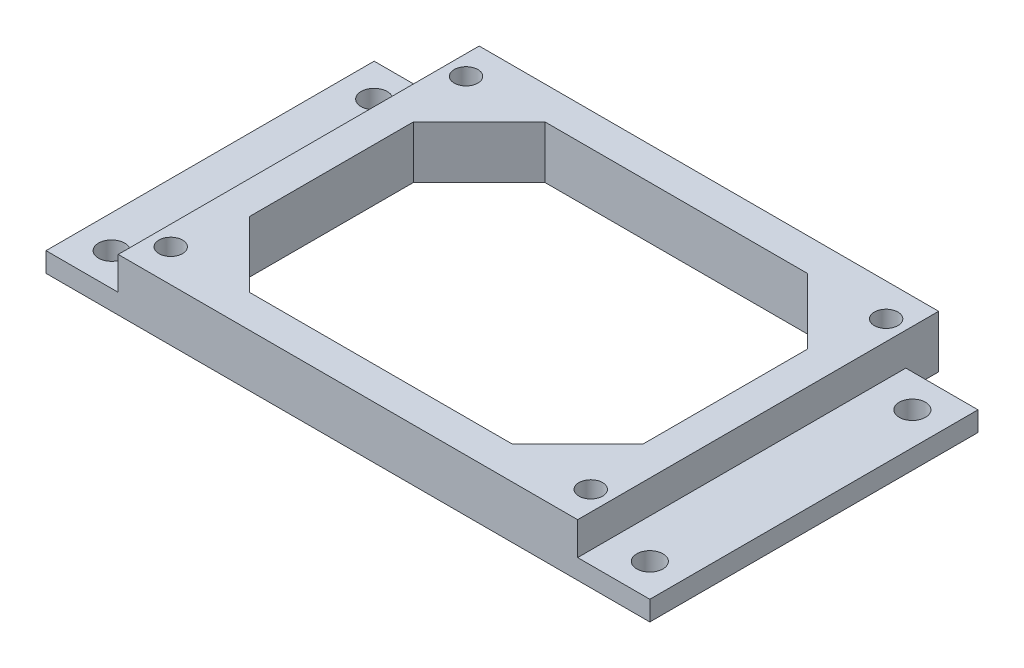
ISO-10303-21;
HEADER;
FILE_DESCRIPTION(('STEP AP214'),'2;1');
FILE_NAME('part.step','',(''),(''),'','','');
FILE_SCHEMA(('AUTOMOTIVE_DESIGN { 1 0 10303 214 1 1 1 1 }'));
ENDSEC;
DATA;
#1=APPLICATION_CONTEXT('core data for automotive mechanical design processes');
#2=APPLICATION_PROTOCOL_DEFINITION('international standard','automotive_design',2000,#1);
#3=PRODUCT_CONTEXT('',#1,'mechanical');
#4=PRODUCT('Part','Part','',(#3));
#5=PRODUCT_RELATED_PRODUCT_CATEGORY('part','',(#4));
#6=PRODUCT_DEFINITION_FORMATION('','',#4);
#7=PRODUCT_DEFINITION_CONTEXT('part definition',#1,'design');
#8=PRODUCT_DEFINITION('design','',#6,#7);
#9=PRODUCT_DEFINITION_SHAPE('','',#8);
#10=(LENGTH_UNIT() NAMED_UNIT(*) SI_UNIT(.MILLI.,.METRE.));
#11=(NAMED_UNIT(*) PLANE_ANGLE_UNIT() SI_UNIT($,.RADIAN.));
#12=(NAMED_UNIT(*) SI_UNIT($,.STERADIAN.) SOLID_ANGLE_UNIT());
#13=UNCERTAINTY_MEASURE_WITH_UNIT(LENGTH_MEASURE(1.E-05),#10,'distance_accuracy_value','');
#14=(GEOMETRIC_REPRESENTATION_CONTEXT(3) GLOBAL_UNCERTAINTY_ASSIGNED_CONTEXT((#13)) GLOBAL_UNIT_ASSIGNED_CONTEXT((#10,
#11,#12)) REPRESENTATION_CONTEXT('',''));
#15=CARTESIAN_POINT('',(0.,0.,0.));
#16=DIRECTION('',(0.,0.,1.));
#17=DIRECTION('',(1.,0.,0.));
#18=AXIS2_PLACEMENT_3D('',#15,#16,#17);
#19=CARTESIAN_POINT('',(-35.,5.,-25.));
#20=DIRECTION('',(0.,0.,1.));
#21=DIRECTION('',(1.,0.,0.));
#22=AXIS2_PLACEMENT_3D('',#19,#20,#21);
#23=PLANE('',#22);
#24=DIRECTION('',(0.,-1.,0.));
#25=VECTOR('',#24,1.);
#26=CARTESIAN_POINT('',(35.,5.,-25.));
#27=LINE('',#26,#25);
#28=CARTESIAN_POINT('',(35.,0.,-25.));
#29=VERTEX_POINT('',#28);
#30=CARTESIAN_POINT('',(35.,-3.,-25.));
#31=VERTEX_POINT('',#30);
#32=EDGE_CURVE('E11',#29,#31,#27,.T.);
#33=ORIENTED_EDGE('',*,*,#32,.F.);
#34=DIRECTION('',(1.,0.,0.));
#35=VECTOR('',#34,1.);
#36=CARTESIAN_POINT('',(-46.,0.,-25.));
#37=LINE('',#36,#35);
#38=CARTESIAN_POINT('',(46.,0.,-25.));
#39=VERTEX_POINT('',#38);
#40=EDGE_CURVE('E312',#29,#39,#37,.T.);
#41=ORIENTED_EDGE('',*,*,#40,.T.);
#42=DIRECTION('',(0.,1.,0.));
#43=VECTOR('',#42,1.);
#44=CARTESIAN_POINT('',(46.,-3.,-25.));
#45=LINE('',#44,#43);
#46=CARTESIAN_POINT('',(46.,-3.,-25.));
#47=VERTEX_POINT('',#46);
#48=EDGE_CURVE('E303',#47,#39,#45,.T.);
#49=ORIENTED_EDGE('',*,*,#48,.F.);
#50=DIRECTION('',(1.,0.,0.));
#51=VECTOR('',#50,1.);
#52=CARTESIAN_POINT('',(-46.,-3.,-25.));
#53=LINE('',#52,#51);
#54=EDGE_CURVE('E299',#31,#47,#53,.T.);
#55=ORIENTED_EDGE('',*,*,#54,.F.);
#56=EDGE_LOOP('',(#33,#41,#49,#55));
#57=FACE_BOUND('',#56,.T.);
#58=ADVANCED_FACE('F41',(#57),#23,.F.);
#59=DIRECTION('',(0.,1.,0.));
#60=VECTOR('',#59,1.);
#61=CARTESIAN_POINT('',(-35.,5.,-25.));
#62=LINE('',#61,#60);
#63=CARTESIAN_POINT('',(-35.,-3.,-25.));
#64=VERTEX_POINT('',#63);
#65=CARTESIAN_POINT('',(-35.,0.,-25.));
#66=VERTEX_POINT('',#65);
#67=EDGE_CURVE('E254',#64,#66,#62,.T.);
#68=ORIENTED_EDGE('',*,*,#67,.F.);
#69=CARTESIAN_POINT('',(-46.,-3.,-25.));
#70=VERTEX_POINT('',#69);
#71=EDGE_CURVE('E300',#70,#64,#53,.T.);
#72=ORIENTED_EDGE('',*,*,#71,.F.);
#73=DIRECTION('',(0.,1.,0.));
#74=VECTOR('',#73,1.);
#75=CARTESIAN_POINT('',(-46.,-3.,-25.));
#76=LINE('',#75,#74);
#77=CARTESIAN_POINT('',(-46.,0.,-25.));
#78=VERTEX_POINT('',#77);
#79=EDGE_CURVE('E317',#70,#78,#76,.T.);
#80=ORIENTED_EDGE('',*,*,#79,.T.);
#81=EDGE_CURVE('E295',#78,#66,#37,.T.);
#82=ORIENTED_EDGE('',*,*,#81,.T.);
#83=EDGE_LOOP('',(#68,#72,#80,#82));
#84=FACE_BOUND('',#83,.T.);
#85=ADVANCED_FACE('F369',(#84),#23,.F.);
#86=CARTESIAN_POINT('',(35.,5.,25.));
#87=DIRECTION('',(-1.,0.,0.));
#88=DIRECTION('',(0.,0.,1.));
#89=AXIS2_PLACEMENT_3D('',#86,#87,#88);
#90=PLANE('',#89);
#91=DIRECTION('',(0.,0.,-1.));
#92=VECTOR('',#91,1.);
#93=CARTESIAN_POINT('',(35.,0.,25.));
#94=LINE('',#93,#92);
#95=CARTESIAN_POINT('',(35.,0.,25.));
#96=VERTEX_POINT('',#95);
#97=EDGE_CURVE('E326',#96,#29,#94,.T.);
#98=ORIENTED_EDGE('',*,*,#97,.T.);
#99=ORIENTED_EDGE('',*,*,#32,.T.);
#100=DIRECTION('',(0.,0.,1.));
#101=VECTOR('',#100,1.);
#102=CARTESIAN_POINT('',(35.,-3.,-30.));
#103=LINE('',#102,#101);
#104=CARTESIAN_POINT('',(35.,-3.,-30.));
#105=VERTEX_POINT('',#104);
#106=EDGE_CURVE('E265',#105,#31,#103,.T.);
#107=ORIENTED_EDGE('',*,*,#106,.F.);
#108=DIRECTION('',(0.,-1.,0.));
#109=VECTOR('',#108,1.);
#110=CARTESIAN_POINT('',(35.,5.,-30.));
#111=LINE('',#110,#109);
#112=CARTESIAN_POINT('',(35.,5.,-30.));
#113=VERTEX_POINT('',#112);
#114=EDGE_CURVE('E250',#113,#105,#111,.T.);
#115=ORIENTED_EDGE('',*,*,#114,.F.);
#116=DIRECTION('',(0.,0.,-1.));
#117=VECTOR('',#116,1.);
#118=CARTESIAN_POINT('',(35.,5.,25.));
#119=LINE('',#118,#117);
#120=CARTESIAN_POINT('',(35.,5.,25.));
#121=VERTEX_POINT('',#120);
#122=EDGE_CURVE('E327',#121,#113,#119,.T.);
#123=ORIENTED_EDGE('',*,*,#122,.F.);
#124=DIRECTION('',(0.,-1.,0.));
#125=VECTOR('',#124,1.);
#126=CARTESIAN_POINT('',(35.,5.,25.));
#127=LINE('',#126,#125);
#128=EDGE_CURVE('E334',#121,#96,#127,.T.);
#129=ORIENTED_EDGE('',*,*,#128,.T.);
#130=EDGE_LOOP('',(#98,#99,#107,#115,#123,#129));
#131=FACE_BOUND('',#130,.T.);
#132=ADVANCED_FACE('F43',(#131),#90,.F.);
#133=CARTESIAN_POINT('',(-35.,5.,25.));
#134=DIRECTION('',(1.,0.,0.));
#135=DIRECTION('',(0.,0.,-1.));
#136=AXIS2_PLACEMENT_3D('',#133,#134,#135);
#137=PLANE('',#136);
#138=DIRECTION('',(0.,0.,1.));
#139=VECTOR('',#138,1.);
#140=CARTESIAN_POINT('',(-35.,0.,25.));
#141=LINE('',#140,#139);
#142=CARTESIAN_POINT('',(-35.,0.,25.));
#143=VERTEX_POINT('',#142);
#144=EDGE_CURVE('E330',#66,#143,#141,.T.);
#145=ORIENTED_EDGE('',*,*,#144,.T.);
#146=DIRECTION('',(0.,-1.,0.));
#147=VECTOR('',#146,1.);
#148=CARTESIAN_POINT('',(-35.,5.,25.));
#149=LINE('',#148,#147);
#150=CARTESIAN_POINT('',(-35.,5.,25.));
#151=VERTEX_POINT('',#150);
#152=EDGE_CURVE('E50',#151,#143,#149,.T.);
#153=ORIENTED_EDGE('',*,*,#152,.F.);
#154=DIRECTION('',(0.,0.,1.));
#155=VECTOR('',#154,1.);
#156=CARTESIAN_POINT('',(-35.,5.,25.));
#157=LINE('',#156,#155);
#158=CARTESIAN_POINT('',(-35.,5.,-30.));
#159=VERTEX_POINT('',#158);
#160=EDGE_CURVE('E329',#159,#151,#157,.T.);
#161=ORIENTED_EDGE('',*,*,#160,.F.);
#162=DIRECTION('',(0.,1.,0.));
#163=VECTOR('',#162,1.);
#164=CARTESIAN_POINT('',(-35.,5.,-30.));
#165=LINE('',#164,#163);
#166=CARTESIAN_POINT('',(-35.,-3.,-30.));
#167=VERTEX_POINT('',#166);
#168=EDGE_CURVE('E256',#167,#159,#165,.T.);
#169=ORIENTED_EDGE('',*,*,#168,.F.);
#170=DIRECTION('',(0.,0.,1.));
#171=VECTOR('',#170,1.);
#172=CARTESIAN_POINT('',(-35.,-3.,-30.));
#173=LINE('',#172,#171);
#174=EDGE_CURVE('E261',#167,#64,#173,.T.);
#175=ORIENTED_EDGE('',*,*,#174,.T.);
#176=ORIENTED_EDGE('',*,*,#67,.T.);
#177=EDGE_LOOP('',(#145,#153,#161,#169,#175,#176));
#178=FACE_BOUND('',#177,.T.);
#179=ADVANCED_FACE('F376',(#178),#137,.F.);
#180=CARTESIAN_POINT('',(-35.,5.,25.));
#181=DIRECTION('',(0.,0.,-1.));
#182=DIRECTION('',(-1.,0.,0.));
#183=AXIS2_PLACEMENT_3D('',#180,#181,#182);
#184=PLANE('',#183);
#185=ORIENTED_EDGE('',*,*,#152,.T.);
#186=DIRECTION('',(-1.,0.,0.));
#187=VECTOR('',#186,1.);
#188=CARTESIAN_POINT('',(-46.,0.,25.));
#189=LINE('',#188,#187);
#190=CARTESIAN_POINT('',(-46.,0.,25.));
#191=VERTEX_POINT('',#190);
#192=EDGE_CURVE('E306',#143,#191,#189,.T.);
#193=ORIENTED_EDGE('',*,*,#192,.T.);
#194=DIRECTION('',(0.,1.,0.));
#195=VECTOR('',#194,1.);
#196=CARTESIAN_POINT('',(-46.,-3.,25.));
#197=LINE('',#196,#195);
#198=CARTESIAN_POINT('',(-46.,-3.,25.));
#199=VERTEX_POINT('',#198);
#200=EDGE_CURVE('E320',#199,#191,#197,.T.);
#201=ORIENTED_EDGE('',*,*,#200,.F.);
#202=DIRECTION('',(-1.,0.,0.));
#203=VECTOR('',#202,1.);
#204=CARTESIAN_POINT('',(-46.,-3.,25.));
#205=LINE('',#204,#203);
#206=CARTESIAN_POINT('',(46.,-3.,25.));
#207=VERTEX_POINT('',#206);
#208=EDGE_CURVE('E294',#207,#199,#205,.T.);
#209=ORIENTED_EDGE('',*,*,#208,.F.);
#210=DIRECTION('',(0.,1.,0.));
#211=VECTOR('',#210,1.);
#212=CARTESIAN_POINT('',(46.,-3.,25.));
#213=LINE('',#212,#211);
#214=CARTESIAN_POINT('',(46.,0.,25.));
#215=VERTEX_POINT('',#214);
#216=EDGE_CURVE('E323',#207,#215,#213,.T.);
#217=ORIENTED_EDGE('',*,*,#216,.T.);
#218=EDGE_CURVE('E307',#215,#96,#189,.T.);
#219=ORIENTED_EDGE('',*,*,#218,.T.);
#220=ORIENTED_EDGE('',*,*,#128,.F.);
#221=DIRECTION('',(1.,0.,0.));
#222=VECTOR('',#221,1.);
#223=CARTESIAN_POINT('',(-35.,5.,25.));
#224=LINE('',#223,#222);
#225=EDGE_CURVE('E332',#151,#121,#224,.T.);
#226=ORIENTED_EDGE('',*,*,#225,.F.);
#227=EDGE_LOOP('',(#185,#193,#201,#209,#217,#219,#220,#226));
#228=FACE_BOUND('',#227,.T.);
#229=ADVANCED_FACE('F379',(#228),#184,.F.);
#230=CARTESIAN_POINT('',(0.,5.,0.));
#231=DIRECTION('',(0.,-1.,0.));
#232=DIRECTION('',(0.,0.,-1.));
#233=AXIS2_PLACEMENT_3D('',#230,#231,#232);
#234=PLANE('',#233);
#235=DIRECTION('',(-0.707106781186548,0.,-0.707106781186548));
#236=VECTOR('',#235,1.);
#237=CARTESIAN_POINT('',(30.,5.,-15.));
#238=LINE('',#237,#236);
#239=CARTESIAN_POINT('',(30.,5.,-15.));
#240=VERTEX_POINT('',#239);
#241=CARTESIAN_POINT('',(20.,5.,-25.));
#242=VERTEX_POINT('',#241);
#243=EDGE_CURVE('E206',#240,#242,#238,.T.);
#244=ORIENTED_EDGE('',*,*,#243,.F.);
#245=DIRECTION('',(0.,0.,-1.));
#246=VECTOR('',#245,1.);
#247=CARTESIAN_POINT('',(30.,5.,10.));
#248=LINE('',#247,#246);
#249=CARTESIAN_POINT('',(30.,5.,10.));
#250=VERTEX_POINT('',#249);
#251=EDGE_CURVE('E58',#250,#240,#248,.T.);
#252=ORIENTED_EDGE('',*,*,#251,.F.);
#253=DIRECTION('',(0.707106781186548,0.,-0.707106781186548));
#254=VECTOR('',#253,1.);
#255=CARTESIAN_POINT('',(20.,5.,20.));
#256=LINE('',#255,#254);
#257=CARTESIAN_POINT('',(20.,5.,20.));
#258=VERTEX_POINT('',#257);
#259=EDGE_CURVE('E186',#258,#250,#256,.T.);
#260=ORIENTED_EDGE('',*,*,#259,.F.);
#261=DIRECTION('',(1.,0.,0.));
#262=VECTOR('',#261,1.);
#263=CARTESIAN_POINT('',(-20.,5.,20.));
#264=LINE('',#263,#262);
#265=CARTESIAN_POINT('',(-20.,5.,20.));
#266=VERTEX_POINT('',#265);
#267=EDGE_CURVE('E189',#266,#258,#264,.T.);
#268=ORIENTED_EDGE('',*,*,#267,.F.);
#269=DIRECTION('',(0.707106781186547,0.,0.707106781186548));
#270=VECTOR('',#269,1.);
#271=CARTESIAN_POINT('',(-30.,5.,10.));
#272=LINE('',#271,#270);
#273=CARTESIAN_POINT('',(-30.,5.,10.));
#274=VERTEX_POINT('',#273);
#275=EDGE_CURVE('E217',#274,#266,#272,.T.);
#276=ORIENTED_EDGE('',*,*,#275,.F.);
#277=DIRECTION('',(0.,0.,1.));
#278=VECTOR('',#277,1.);
#279=CARTESIAN_POINT('',(-30.,5.,-15.));
#280=LINE('',#279,#278);
#281=CARTESIAN_POINT('',(-30.,5.,-15.));
#282=VERTEX_POINT('',#281);
#283=EDGE_CURVE('E214',#282,#274,#280,.T.);
#284=ORIENTED_EDGE('',*,*,#283,.F.);
#285=DIRECTION('',(-0.707106781186548,0.,0.707106781186547));
#286=VECTOR('',#285,1.);
#287=CARTESIAN_POINT('',(-20.,5.,-25.));
#288=LINE('',#287,#286);
#289=CARTESIAN_POINT('',(-20.,5.,-25.));
#290=VERTEX_POINT('',#289);
#291=EDGE_CURVE('E211',#290,#282,#288,.T.);
#292=ORIENTED_EDGE('',*,*,#291,.F.);
#293=DIRECTION('',(-1.,0.,0.));
#294=VECTOR('',#293,1.);
#295=CARTESIAN_POINT('',(20.,5.,-25.));
#296=LINE('',#295,#294);
#297=EDGE_CURVE('E208',#242,#290,#296,.T.);
#298=ORIENTED_EDGE('',*,*,#297,.F.);
#299=EDGE_LOOP('',(#244,#252,#260,#268,#276,#284,#292,#298));
#300=FACE_BOUND('',#299,.T.);
#301=CARTESIAN_POINT('',(32.,5.,20.));
#302=DIRECTION('',(0.,1.,0.));
#303=DIRECTION('',(0.,0.,1.));
#304=AXIS2_PLACEMENT_3D('',#301,#302,#303);
#305=CIRCLE('',#304,1.8);
#306=CARTESIAN_POINT('',(32.,5.,21.8));
#307=VERTEX_POINT('',#306);
#308=EDGE_CURVE('E224',#307,#307,#305,.T.);
#309=ORIENTED_EDGE('',*,*,#308,.F.);
#310=EDGE_LOOP('',(#309));
#311=FACE_BOUND('',#310,.T.);
#312=CARTESIAN_POINT('',(-32.,5.,-25.));
#313=DIRECTION('',(0.,1.,0.));
#314=DIRECTION('',(0.,0.,1.));
#315=AXIS2_PLACEMENT_3D('',#312,#313,#314);
#316=CIRCLE('',#315,1.8);
#317=CARTESIAN_POINT('',(-32.,5.,-23.2));
#318=VERTEX_POINT('',#317);
#319=EDGE_CURVE('E238',#318,#318,#316,.T.);
#320=ORIENTED_EDGE('',*,*,#319,.F.);
#321=EDGE_LOOP('',(#320));
#322=FACE_BOUND('',#321,.T.);
#323=CARTESIAN_POINT('',(32.,5.,-25.));
#324=DIRECTION('',(0.,1.,0.));
#325=DIRECTION('',(0.,0.,1.));
#326=AXIS2_PLACEMENT_3D('',#323,#324,#325);
#327=CIRCLE('',#326,1.8);
#328=CARTESIAN_POINT('',(32.,5.,-23.2));
#329=VERTEX_POINT('',#328);
#330=EDGE_CURVE('E242',#329,#329,#327,.T.);
#331=ORIENTED_EDGE('',*,*,#330,.F.);
#332=EDGE_LOOP('',(#331));
#333=FACE_BOUND('',#332,.T.);
#334=CARTESIAN_POINT('',(-32.,5.,20.));
#335=DIRECTION('',(0.,1.,0.));
#336=DIRECTION('',(0.,0.,1.));
#337=AXIS2_PLACEMENT_3D('',#334,#335,#336);
#338=CIRCLE('',#337,1.8);
#339=CARTESIAN_POINT('',(-32.,5.,21.8));
#340=VERTEX_POINT('',#339);
#341=EDGE_CURVE('E246',#340,#340,#338,.T.);
#342=ORIENTED_EDGE('',*,*,#341,.F.);
#343=EDGE_LOOP('',(#342));
#344=FACE_BOUND('',#343,.T.);
#345=ORIENTED_EDGE('',*,*,#122,.T.);
#346=DIRECTION('',(1.,0.,0.));
#347=VECTOR('',#346,1.);
#348=CARTESIAN_POINT('',(35.,5.,-30.));
#349=LINE('',#348,#347);
#350=EDGE_CURVE('E259',#159,#113,#349,.T.);
#351=ORIENTED_EDGE('',*,*,#350,.F.);
#352=ORIENTED_EDGE('',*,*,#160,.T.);
#353=ORIENTED_EDGE('',*,*,#225,.T.);
#354=EDGE_LOOP('',(#345,#351,#352,#353));
#355=FACE_BOUND('',#354,.T.);
#356=ADVANCED_FACE('F383',(#300,#311,#322,#333,#344,#355),#234,.F.);
#357=CARTESIAN_POINT('',(0.,0.,0.));
#358=DIRECTION('',(0.,1.,0.));
#359=DIRECTION('',(0.,0.,1.));
#360=AXIS2_PLACEMENT_3D('',#357,#358,#359);
#361=PLANE('',#360);
#362=CARTESIAN_POINT('',(41.,0.,-20.));
#363=DIRECTION('',(0.,1.,0.));
#364=DIRECTION('',(0.,0.,1.));
#365=AXIS2_PLACEMENT_3D('',#362,#363,#364);
#366=CIRCLE('',#365,2.);
#367=CARTESIAN_POINT('',(41.,0.,-18.));
#368=VERTEX_POINT('',#367);
#369=EDGE_CURVE('E278',#368,#368,#366,.T.);
#370=ORIENTED_EDGE('',*,*,#369,.F.);
#371=EDGE_LOOP('',(#370));
#372=FACE_BOUND('',#371,.T.);
#373=CARTESIAN_POINT('',(41.,0.,20.));
#374=DIRECTION('',(0.,1.,0.));
#375=DIRECTION('',(0.,0.,1.));
#376=AXIS2_PLACEMENT_3D('',#373,#374,#375);
#377=CIRCLE('',#376,2.);
#378=CARTESIAN_POINT('',(41.,0.,22.));
#379=VERTEX_POINT('',#378);
#380=EDGE_CURVE('E284',#379,#379,#377,.T.);
#381=ORIENTED_EDGE('',*,*,#380,.F.);
#382=EDGE_LOOP('',(#381));
#383=FACE_BOUND('',#382,.T.);
#384=ORIENTED_EDGE('',*,*,#97,.F.);
#385=ORIENTED_EDGE('',*,*,#218,.F.);
#386=DIRECTION('',(0.,0.,1.));
#387=VECTOR('',#386,1.);
#388=CARTESIAN_POINT('',(46.,0.,-25.));
#389=LINE('',#388,#387);
#390=EDGE_CURVE('E290',#39,#215,#389,.T.);
#391=ORIENTED_EDGE('',*,*,#390,.F.);
#392=ORIENTED_EDGE('',*,*,#40,.F.);
#393=EDGE_LOOP('',(#384,#385,#391,#392));
#394=FACE_BOUND('',#393,.T.);
#395=ADVANCED_FACE('F387',(#372,#383,#394),#361,.T.);
#396=CARTESIAN_POINT('',(-41.,0.,-20.));
#397=DIRECTION('',(0.,1.,0.));
#398=DIRECTION('',(0.,0.,1.));
#399=AXIS2_PLACEMENT_3D('',#396,#397,#398);
#400=CIRCLE('',#399,2.);
#401=CARTESIAN_POINT('',(-41.,0.,-18.));
#402=VERTEX_POINT('',#401);
#403=EDGE_CURVE('E268',#402,#402,#400,.T.);
#404=ORIENTED_EDGE('',*,*,#403,.F.);
#405=EDGE_LOOP('',(#404));
#406=FACE_BOUND('',#405,.T.);
#407=CARTESIAN_POINT('',(-41.,0.,20.));
#408=DIRECTION('',(0.,1.,0.));
#409=DIRECTION('',(0.,0.,1.));
#410=AXIS2_PLACEMENT_3D('',#407,#408,#409);
#411=CIRCLE('',#410,2.);
#412=CARTESIAN_POINT('',(-41.,0.,22.));
#413=VERTEX_POINT('',#412);
#414=EDGE_CURVE('E274',#413,#413,#411,.T.);
#415=ORIENTED_EDGE('',*,*,#414,.F.);
#416=EDGE_LOOP('',(#415));
#417=FACE_BOUND('',#416,.T.);
#418=ORIENTED_EDGE('',*,*,#144,.F.);
#419=ORIENTED_EDGE('',*,*,#81,.F.);
#420=DIRECTION('',(0.,0.,-1.));
#421=VECTOR('',#420,1.);
#422=CARTESIAN_POINT('',(-46.,0.,-25.));
#423=LINE('',#422,#421);
#424=EDGE_CURVE('E310',#191,#78,#423,.T.);
#425=ORIENTED_EDGE('',*,*,#424,.F.);
#426=ORIENTED_EDGE('',*,*,#192,.F.);
#427=EDGE_LOOP('',(#418,#419,#425,#426));
#428=FACE_BOUND('',#427,.T.);
#429=ADVANCED_FACE('F393',(#406,#417,#428),#361,.T.);
#430=CARTESIAN_POINT('',(46.,-3.,-25.));
#431=DIRECTION('',(-1.,0.,0.));
#432=DIRECTION('',(0.,0.,1.));
#433=AXIS2_PLACEMENT_3D('',#430,#431,#432);
#434=PLANE('',#433);
#435=ORIENTED_EDGE('',*,*,#390,.T.);
#436=ORIENTED_EDGE('',*,*,#216,.F.);
#437=DIRECTION('',(0.,0.,1.));
#438=VECTOR('',#437,1.);
#439=CARTESIAN_POINT('',(46.,-3.,-25.));
#440=LINE('',#439,#438);
#441=EDGE_CURVE('E291',#47,#207,#440,.T.);
#442=ORIENTED_EDGE('',*,*,#441,.F.);
#443=ORIENTED_EDGE('',*,*,#48,.T.);
#444=EDGE_LOOP('',(#435,#436,#442,#443));
#445=FACE_BOUND('',#444,.T.);
#446=ADVANCED_FACE('F389',(#445),#434,.F.);
#447=CARTESIAN_POINT('',(-46.,-3.,-25.));
#448=DIRECTION('',(1.,0.,0.));
#449=DIRECTION('',(0.,0.,-1.));
#450=AXIS2_PLACEMENT_3D('',#447,#448,#449);
#451=PLANE('',#450);
#452=ORIENTED_EDGE('',*,*,#424,.T.);
#453=ORIENTED_EDGE('',*,*,#79,.F.);
#454=DIRECTION('',(0.,0.,-1.));
#455=VECTOR('',#454,1.);
#456=CARTESIAN_POINT('',(-46.,-3.,-25.));
#457=LINE('',#456,#455);
#458=EDGE_CURVE('E297',#199,#70,#457,.T.);
#459=ORIENTED_EDGE('',*,*,#458,.F.);
#460=ORIENTED_EDGE('',*,*,#200,.T.);
#461=EDGE_LOOP('',(#452,#453,#459,#460));
#462=FACE_BOUND('',#461,.T.);
#463=ADVANCED_FACE('F392',(#462),#451,.F.);
#464=CARTESIAN_POINT('',(0.,-3.,0.));
#465=DIRECTION('',(0.,1.,0.));
#466=DIRECTION('',(0.,0.,1.));
#467=AXIS2_PLACEMENT_3D('',#464,#465,#466);
#468=PLANE('',#467);
#469=DIRECTION('',(0.707106781186548,0.,-0.707106781186548));
#470=VECTOR('',#469,1.);
#471=CARTESIAN_POINT('',(20.,-3.,20.));
#472=LINE('',#471,#470);
#473=CARTESIAN_POINT('',(20.,-3.,20.));
#474=VERTEX_POINT('',#473);
#475=CARTESIAN_POINT('',(30.,-3.,10.));
#476=VERTEX_POINT('',#475);
#477=EDGE_CURVE('E175',#474,#476,#472,.T.);
#478=ORIENTED_EDGE('',*,*,#477,.T.);
#479=DIRECTION('',(0.,0.,-1.));
#480=VECTOR('',#479,1.);
#481=CARTESIAN_POINT('',(30.,-3.,10.));
#482=LINE('',#481,#480);
#483=CARTESIAN_POINT('',(30.,-3.,-15.));
#484=VERTEX_POINT('',#483);
#485=EDGE_CURVE('E169',#476,#484,#482,.T.);
#486=ORIENTED_EDGE('',*,*,#485,.T.);
#487=DIRECTION('',(-0.707106781186548,0.,-0.707106781186548));
#488=VECTOR('',#487,1.);
#489=CARTESIAN_POINT('',(30.,-3.,-15.));
#490=LINE('',#489,#488);
#491=CARTESIAN_POINT('',(20.,-3.,-25.));
#492=VERTEX_POINT('',#491);
#493=EDGE_CURVE('E178',#484,#492,#490,.T.);
#494=ORIENTED_EDGE('',*,*,#493,.T.);
#495=DIRECTION('',(-1.,0.,0.));
#496=VECTOR('',#495,1.);
#497=CARTESIAN_POINT('',(20.,-3.,-25.));
#498=LINE('',#497,#496);
#499=CARTESIAN_POINT('',(-20.,-3.,-25.));
#500=VERTEX_POINT('',#499);
#501=EDGE_CURVE('E66',#492,#500,#498,.T.);
#502=ORIENTED_EDGE('',*,*,#501,.T.);
#503=DIRECTION('',(-0.707106781186548,0.,0.707106781186547));
#504=VECTOR('',#503,1.);
#505=CARTESIAN_POINT('',(-20.,-3.,-25.));
#506=LINE('',#505,#504);
#507=CARTESIAN_POINT('',(-30.,-3.,-15.));
#508=VERTEX_POINT('',#507);
#509=EDGE_CURVE('E193',#500,#508,#506,.T.);
#510=ORIENTED_EDGE('',*,*,#509,.T.);
#511=DIRECTION('',(0.,0.,1.));
#512=VECTOR('',#511,1.);
#513=CARTESIAN_POINT('',(-30.,-3.,-15.));
#514=LINE('',#513,#512);
#515=CARTESIAN_POINT('',(-30.,-3.,10.));
#516=VERTEX_POINT('',#515);
#517=EDGE_CURVE('E196',#508,#516,#514,.T.);
#518=ORIENTED_EDGE('',*,*,#517,.T.);
#519=DIRECTION('',(0.707106781186547,0.,0.707106781186548));
#520=VECTOR('',#519,1.);
#521=CARTESIAN_POINT('',(-30.,-3.,10.));
#522=LINE('',#521,#520);
#523=CARTESIAN_POINT('',(-20.,-3.,20.));
#524=VERTEX_POINT('',#523);
#525=EDGE_CURVE('E199',#516,#524,#522,.T.);
#526=ORIENTED_EDGE('',*,*,#525,.T.);
#527=DIRECTION('',(1.,0.,0.));
#528=VECTOR('',#527,1.);
#529=CARTESIAN_POINT('',(-20.,-3.,20.));
#530=LINE('',#529,#528);
#531=EDGE_CURVE('E202',#524,#474,#530,.T.);
#532=ORIENTED_EDGE('',*,*,#531,.T.);
#533=EDGE_LOOP('',(#478,#486,#494,#502,#510,#518,#526,#532));
#534=FACE_BOUND('',#533,.T.);
#535=CARTESIAN_POINT('',(32.,-3.,20.));
#536=DIRECTION('',(0.,1.,0.));
#537=DIRECTION('',(0.,0.,1.));
#538=AXIS2_PLACEMENT_3D('',#535,#536,#537);
#539=CIRCLE('',#538,1.8);
#540=CARTESIAN_POINT('',(32.,-3.,21.8));
#541=VERTEX_POINT('',#540);
#542=EDGE_CURVE('E45',#541,#541,#539,.T.);
#543=ORIENTED_EDGE('',*,*,#542,.T.);
#544=EDGE_LOOP('',(#543));
#545=FACE_BOUND('',#544,.T.);
#546=CARTESIAN_POINT('',(-32.,-3.,-25.));
#547=DIRECTION('',(0.,1.,0.));
#548=DIRECTION('',(0.,0.,1.));
#549=AXIS2_PLACEMENT_3D('',#546,#547,#548);
#550=CIRCLE('',#549,1.8);
#551=CARTESIAN_POINT('',(-32.,-3.,-23.2));
#552=VERTEX_POINT('',#551);
#553=EDGE_CURVE('E241',#552,#552,#550,.T.);
#554=ORIENTED_EDGE('',*,*,#553,.T.);
#555=EDGE_LOOP('',(#554));
#556=FACE_BOUND('',#555,.T.);
#557=CARTESIAN_POINT('',(32.,-3.,-25.));
#558=DIRECTION('',(0.,1.,0.));
#559=DIRECTION('',(0.,0.,1.));
#560=AXIS2_PLACEMENT_3D('',#557,#558,#559);
#561=CIRCLE('',#560,1.8);
#562=CARTESIAN_POINT('',(32.,-3.,-23.2));
#563=VERTEX_POINT('',#562);
#564=EDGE_CURVE('E245',#563,#563,#561,.T.);
#565=ORIENTED_EDGE('',*,*,#564,.T.);
#566=EDGE_LOOP('',(#565));
#567=FACE_BOUND('',#566,.T.);
#568=CARTESIAN_POINT('',(-32.,-3.,20.));
#569=DIRECTION('',(0.,1.,0.));
#570=DIRECTION('',(0.,0.,1.));
#571=AXIS2_PLACEMENT_3D('',#568,#569,#570);
#572=CIRCLE('',#571,1.8);
#573=CARTESIAN_POINT('',(-32.,-3.,21.8));
#574=VERTEX_POINT('',#573);
#575=EDGE_CURVE('E249',#574,#574,#572,.T.);
#576=ORIENTED_EDGE('',*,*,#575,.T.);
#577=EDGE_LOOP('',(#576));
#578=FACE_BOUND('',#577,.T.);
#579=CARTESIAN_POINT('',(-41.,-3.,-20.));
#580=DIRECTION('',(0.,1.,0.));
#581=DIRECTION('',(0.,0.,1.));
#582=AXIS2_PLACEMENT_3D('',#579,#580,#581);
#583=CIRCLE('',#582,2.);
#584=CARTESIAN_POINT('',(-41.,-3.,-18.));
#585=VERTEX_POINT('',#584);
#586=EDGE_CURVE('E271',#585,#585,#583,.T.);
#587=ORIENTED_EDGE('',*,*,#586,.T.);
#588=EDGE_LOOP('',(#587));
#589=FACE_BOUND('',#588,.T.);
#590=CARTESIAN_POINT('',(-41.,-3.,20.));
#591=DIRECTION('',(0.,1.,0.));
#592=DIRECTION('',(0.,0.,1.));
#593=AXIS2_PLACEMENT_3D('',#590,#591,#592);
#594=CIRCLE('',#593,2.);
#595=CARTESIAN_POINT('',(-41.,-3.,22.));
#596=VERTEX_POINT('',#595);
#597=EDGE_CURVE('E277',#596,#596,#594,.T.);
#598=ORIENTED_EDGE('',*,*,#597,.T.);
#599=EDGE_LOOP('',(#598));
#600=FACE_BOUND('',#599,.T.);
#601=CARTESIAN_POINT('',(41.,-3.,-20.));
#602=DIRECTION('',(0.,1.,0.));
#603=DIRECTION('',(0.,0.,1.));
#604=AXIS2_PLACEMENT_3D('',#601,#602,#603);
#605=CIRCLE('',#604,2.);
#606=CARTESIAN_POINT('',(41.,-3.,-18.));
#607=VERTEX_POINT('',#606);
#608=EDGE_CURVE('E281',#607,#607,#605,.T.);
#609=ORIENTED_EDGE('',*,*,#608,.T.);
#610=EDGE_LOOP('',(#609));
#611=FACE_BOUND('',#610,.T.);
#612=CARTESIAN_POINT('',(41.,-3.,20.));
#613=DIRECTION('',(0.,1.,0.));
#614=DIRECTION('',(0.,0.,1.));
#615=AXIS2_PLACEMENT_3D('',#612,#613,#614);
#616=CIRCLE('',#615,2.);
#617=CARTESIAN_POINT('',(41.,-3.,22.));
#618=VERTEX_POINT('',#617);
#619=EDGE_CURVE('E287',#618,#618,#616,.T.);
#620=ORIENTED_EDGE('',*,*,#619,.T.);
#621=EDGE_LOOP('',(#620));
#622=FACE_BOUND('',#621,.T.);
#623=ORIENTED_EDGE('',*,*,#441,.T.);
#624=ORIENTED_EDGE('',*,*,#208,.T.);
#625=ORIENTED_EDGE('',*,*,#458,.T.);
#626=ORIENTED_EDGE('',*,*,#71,.T.);
#627=ORIENTED_EDGE('',*,*,#174,.F.);
#628=DIRECTION('',(-1.,0.,0.));
#629=VECTOR('',#628,1.);
#630=CARTESIAN_POINT('',(35.,-3.,-30.));
#631=LINE('',#630,#629);
#632=EDGE_CURVE('E253',#105,#167,#631,.T.);
#633=ORIENTED_EDGE('',*,*,#632,.F.);
#634=ORIENTED_EDGE('',*,*,#106,.T.);
#635=ORIENTED_EDGE('',*,*,#54,.T.);
#636=EDGE_LOOP('',(#623,#624,#625,#626,#627,#633,#634,#635));
#637=FACE_BOUND('',#636,.T.);
#638=ADVANCED_FACE('F182',(#534,#545,#556,#567,#578,#589,#600,#611,#622,#637),#468,.F.);
#639=CARTESIAN_POINT('',(41.,0.,20.));
#640=DIRECTION('',(0.,1.,0.));
#641=DIRECTION('',(0.,0.,1.));
#642=AXIS2_PLACEMENT_3D('',#639,#640,#641);
#643=CYLINDRICAL_SURFACE('',#642,2.);
#644=ORIENTED_EDGE('',*,*,#380,.T.);
#645=EDGE_LOOP('',(#644));
#646=FACE_BOUND('',#645,.T.);
#647=ORIENTED_EDGE('',*,*,#619,.F.);
#648=EDGE_LOOP('',(#647));
#649=FACE_BOUND('',#648,.T.);
#650=ADVANCED_FACE('F403',(#646,#649),#643,.F.);
#651=CARTESIAN_POINT('',(41.,0.,-20.));
#652=DIRECTION('',(0.,1.,0.));
#653=DIRECTION('',(0.,0.,1.));
#654=AXIS2_PLACEMENT_3D('',#651,#652,#653);
#655=CYLINDRICAL_SURFACE('',#654,2.);
#656=ORIENTED_EDGE('',*,*,#369,.T.);
#657=EDGE_LOOP('',(#656));
#658=FACE_BOUND('',#657,.T.);
#659=ORIENTED_EDGE('',*,*,#608,.F.);
#660=EDGE_LOOP('',(#659));
#661=FACE_BOUND('',#660,.T.);
#662=ADVANCED_FACE('F406',(#658,#661),#655,.F.);
#663=CARTESIAN_POINT('',(-41.,0.,20.));
#664=DIRECTION('',(0.,1.,0.));
#665=DIRECTION('',(0.,0.,1.));
#666=AXIS2_PLACEMENT_3D('',#663,#664,#665);
#667=CYLINDRICAL_SURFACE('',#666,2.);
#668=ORIENTED_EDGE('',*,*,#414,.T.);
#669=EDGE_LOOP('',(#668));
#670=FACE_BOUND('',#669,.T.);
#671=ORIENTED_EDGE('',*,*,#597,.F.);
#672=EDGE_LOOP('',(#671));
#673=FACE_BOUND('',#672,.T.);
#674=ADVANCED_FACE('F410',(#670,#673),#667,.F.);
#675=CARTESIAN_POINT('',(-41.,0.,-20.));
#676=DIRECTION('',(0.,1.,0.));
#677=DIRECTION('',(0.,0.,1.));
#678=AXIS2_PLACEMENT_3D('',#675,#676,#677);
#679=CYLINDRICAL_SURFACE('',#678,2.);
#680=ORIENTED_EDGE('',*,*,#403,.T.);
#681=EDGE_LOOP('',(#680));
#682=FACE_BOUND('',#681,.T.);
#683=ORIENTED_EDGE('',*,*,#586,.F.);
#684=EDGE_LOOP('',(#683));
#685=FACE_BOUND('',#684,.T.);
#686=ADVANCED_FACE('F414',(#682,#685),#679,.F.);
#687=CARTESIAN_POINT('',(0.,0.,-30.));
#688=DIRECTION('',(0.,0.,-1.));
#689=DIRECTION('',(-1.,0.,0.));
#690=AXIS2_PLACEMENT_3D('',#687,#688,#689);
#691=PLANE('',#690);
#692=ORIENTED_EDGE('',*,*,#114,.T.);
#693=ORIENTED_EDGE('',*,*,#632,.T.);
#694=ORIENTED_EDGE('',*,*,#168,.T.);
#695=ORIENTED_EDGE('',*,*,#350,.T.);
#696=EDGE_LOOP('',(#692,#693,#694,#695));
#697=FACE_BOUND('',#696,.T.);
#698=ADVANCED_FACE('F418',(#697),#691,.T.);
#699=CARTESIAN_POINT('',(-32.,5.,20.));
#700=DIRECTION('',(0.,1.,0.));
#701=DIRECTION('',(0.,0.,1.));
#702=AXIS2_PLACEMENT_3D('',#699,#700,#701);
#703=CYLINDRICAL_SURFACE('',#702,1.8);
#704=ORIENTED_EDGE('',*,*,#341,.T.);
#705=EDGE_LOOP('',(#704));
#706=FACE_BOUND('',#705,.T.);
#707=ORIENTED_EDGE('',*,*,#575,.F.);
#708=EDGE_LOOP('',(#707));
#709=FACE_BOUND('',#708,.T.);
#710=ADVANCED_FACE('F365',(#706,#709),#703,.F.);
#711=CARTESIAN_POINT('',(32.,5.,-25.));
#712=DIRECTION('',(0.,1.,0.));
#713=DIRECTION('',(0.,0.,1.));
#714=AXIS2_PLACEMENT_3D('',#711,#712,#713);
#715=CYLINDRICAL_SURFACE('',#714,1.8);
#716=ORIENTED_EDGE('',*,*,#330,.T.);
#717=EDGE_LOOP('',(#716));
#718=FACE_BOUND('',#717,.T.);
#719=ORIENTED_EDGE('',*,*,#564,.F.);
#720=EDGE_LOOP('',(#719));
#721=FACE_BOUND('',#720,.T.);
#722=ADVANCED_FACE('F356',(#718,#721),#715,.F.);
#723=CARTESIAN_POINT('',(-32.,5.,-25.));
#724=DIRECTION('',(0.,1.,0.));
#725=DIRECTION('',(0.,0.,1.));
#726=AXIS2_PLACEMENT_3D('',#723,#724,#725);
#727=CYLINDRICAL_SURFACE('',#726,1.8);
#728=ORIENTED_EDGE('',*,*,#319,.T.);
#729=EDGE_LOOP('',(#728));
#730=FACE_BOUND('',#729,.T.);
#731=ORIENTED_EDGE('',*,*,#553,.F.);
#732=EDGE_LOOP('',(#731));
#733=FACE_BOUND('',#732,.T.);
#734=ADVANCED_FACE('F353',(#730,#733),#727,.F.);
#735=CARTESIAN_POINT('',(32.,5.,20.));
#736=DIRECTION('',(0.,1.,0.));
#737=DIRECTION('',(0.,0.,1.));
#738=AXIS2_PLACEMENT_3D('',#735,#736,#737);
#739=CYLINDRICAL_SURFACE('',#738,1.8);
#740=ORIENTED_EDGE('',*,*,#308,.T.);
#741=EDGE_LOOP('',(#740));
#742=FACE_BOUND('',#741,.T.);
#743=ORIENTED_EDGE('',*,*,#542,.F.);
#744=EDGE_LOOP('',(#743));
#745=FACE_BOUND('',#744,.T.);
#746=ADVANCED_FACE('F355',(#742,#745),#739,.F.);
#747=CARTESIAN_POINT('',(30.,-3.,10.));
#748=DIRECTION('',(1.,0.,0.));
#749=DIRECTION('',(0.,0.,-1.));
#750=AXIS2_PLACEMENT_3D('',#747,#748,#749);
#751=PLANE('',#750);
#752=ORIENTED_EDGE('',*,*,#251,.T.);
#753=DIRECTION('',(0.,1.,0.));
#754=VECTOR('',#753,1.);
#755=CARTESIAN_POINT('',(30.,-3.,-15.));
#756=LINE('',#755,#754);
#757=EDGE_CURVE('E165',#484,#240,#756,.T.);
#758=ORIENTED_EDGE('',*,*,#757,.F.);
#759=ORIENTED_EDGE('',*,*,#485,.F.);
#760=DIRECTION('',(0.,1.,0.));
#761=VECTOR('',#760,1.);
#762=CARTESIAN_POINT('',(30.,-3.,10.));
#763=LINE('',#762,#761);
#764=EDGE_CURVE('E222',#476,#250,#763,.T.);
#765=ORIENTED_EDGE('',*,*,#764,.T.);
#766=EDGE_LOOP('',(#752,#758,#759,#765));
#767=FACE_BOUND('',#766,.T.);
#768=ADVANCED_FACE('F167',(#767),#751,.F.);
#769=CARTESIAN_POINT('',(20.,-3.,20.));
#770=DIRECTION('',(0.707106781186547,0.,0.707106781186547));
#771=DIRECTION('',(0.707106781186548,0.,-0.707106781186548));
#772=AXIS2_PLACEMENT_3D('',#769,#770,#771);
#773=PLANE('',#772);
#774=ORIENTED_EDGE('',*,*,#259,.T.);
#775=ORIENTED_EDGE('',*,*,#764,.F.);
#776=ORIENTED_EDGE('',*,*,#477,.F.);
#777=DIRECTION('',(0.,1.,0.));
#778=VECTOR('',#777,1.);
#779=CARTESIAN_POINT('',(20.,-3.,20.));
#780=LINE('',#779,#778);
#781=EDGE_CURVE('E225',#474,#258,#780,.T.);
#782=ORIENTED_EDGE('',*,*,#781,.T.);
#783=EDGE_LOOP('',(#774,#775,#776,#782));
#784=FACE_BOUND('',#783,.T.);
#785=ADVANCED_FACE('F531',(#784),#773,.F.);
#786=CARTESIAN_POINT('',(-20.,-3.,20.));
#787=DIRECTION('',(0.,0.,1.));
#788=DIRECTION('',(1.,0.,0.));
#789=AXIS2_PLACEMENT_3D('',#786,#787,#788);
#790=PLANE('',#789);
#791=ORIENTED_EDGE('',*,*,#267,.T.);
#792=ORIENTED_EDGE('',*,*,#781,.F.);
#793=ORIENTED_EDGE('',*,*,#531,.F.);
#794=DIRECTION('',(0.,1.,0.));
#795=VECTOR('',#794,1.);
#796=CARTESIAN_POINT('',(-20.,-3.,20.));
#797=LINE('',#796,#795);
#798=EDGE_CURVE('E227',#524,#266,#797,.T.);
#799=ORIENTED_EDGE('',*,*,#798,.T.);
#800=EDGE_LOOP('',(#791,#792,#793,#799));
#801=FACE_BOUND('',#800,.T.);
#802=ADVANCED_FACE('F540',(#801),#790,.F.);
#803=CARTESIAN_POINT('',(-30.,-3.,10.));
#804=DIRECTION('',(-0.707106781186548,0.,0.707106781186547));
#805=DIRECTION('',(0.707106781186547,0.,0.707106781186548));
#806=AXIS2_PLACEMENT_3D('',#803,#804,#805);
#807=PLANE('',#806);
#808=ORIENTED_EDGE('',*,*,#275,.T.);
#809=ORIENTED_EDGE('',*,*,#798,.F.);
#810=ORIENTED_EDGE('',*,*,#525,.F.);
#811=DIRECTION('',(0.,1.,0.));
#812=VECTOR('',#811,1.);
#813=CARTESIAN_POINT('',(-30.,-3.,10.));
#814=LINE('',#813,#812);
#815=EDGE_CURVE('E229',#516,#274,#814,.T.);
#816=ORIENTED_EDGE('',*,*,#815,.T.);
#817=EDGE_LOOP('',(#808,#809,#810,#816));
#818=FACE_BOUND('',#817,.T.);
#819=ADVANCED_FACE('F550',(#818),#807,.F.);
#820=CARTESIAN_POINT('',(-30.,-3.,-15.));
#821=DIRECTION('',(-1.,0.,0.));
#822=DIRECTION('',(0.,0.,1.));
#823=AXIS2_PLACEMENT_3D('',#820,#821,#822);
#824=PLANE('',#823);
#825=ORIENTED_EDGE('',*,*,#283,.T.);
#826=ORIENTED_EDGE('',*,*,#815,.F.);
#827=ORIENTED_EDGE('',*,*,#517,.F.);
#828=DIRECTION('',(0.,1.,0.));
#829=VECTOR('',#828,1.);
#830=CARTESIAN_POINT('',(-30.,-3.,-15.));
#831=LINE('',#830,#829);
#832=EDGE_CURVE('E231',#508,#282,#831,.T.);
#833=ORIENTED_EDGE('',*,*,#832,.T.);
#834=EDGE_LOOP('',(#825,#826,#827,#833));
#835=FACE_BOUND('',#834,.T.);
#836=ADVANCED_FACE('F560',(#835),#824,.F.);
#837=CARTESIAN_POINT('',(-20.,-3.,-25.));
#838=DIRECTION('',(-0.707106781186547,0.,-0.707106781186548));
#839=DIRECTION('',(-0.707106781186548,0.,0.707106781186547));
#840=AXIS2_PLACEMENT_3D('',#837,#838,#839);
#841=PLANE('',#840);
#842=ORIENTED_EDGE('',*,*,#291,.T.);
#843=ORIENTED_EDGE('',*,*,#832,.F.);
#844=ORIENTED_EDGE('',*,*,#509,.F.);
#845=DIRECTION('',(0.,1.,0.));
#846=VECTOR('',#845,1.);
#847=CARTESIAN_POINT('',(-20.,-3.,-25.));
#848=LINE('',#847,#846);
#849=EDGE_CURVE('E233',#500,#290,#848,.T.);
#850=ORIENTED_EDGE('',*,*,#849,.T.);
#851=EDGE_LOOP('',(#842,#843,#844,#850));
#852=FACE_BOUND('',#851,.T.);
#853=ADVANCED_FACE('F570',(#852),#841,.F.);
#854=CARTESIAN_POINT('',(20.,-3.,-25.));
#855=DIRECTION('',(0.,0.,-1.));
#856=DIRECTION('',(-1.,0.,0.));
#857=AXIS2_PLACEMENT_3D('',#854,#855,#856);
#858=PLANE('',#857);
#859=ORIENTED_EDGE('',*,*,#297,.T.);
#860=ORIENTED_EDGE('',*,*,#849,.F.);
#861=ORIENTED_EDGE('',*,*,#501,.F.);
#862=DIRECTION('',(0.,1.,0.));
#863=VECTOR('',#862,1.);
#864=CARTESIAN_POINT('',(20.,-3.,-25.));
#865=LINE('',#864,#863);
#866=EDGE_CURVE('E174',#492,#242,#865,.T.);
#867=ORIENTED_EDGE('',*,*,#866,.T.);
#868=EDGE_LOOP('',(#859,#860,#861,#867));
#869=FACE_BOUND('',#868,.T.);
#870=ADVANCED_FACE('F580',(#869),#858,.F.);
#871=CARTESIAN_POINT('',(30.,-3.,-15.));
#872=DIRECTION('',(0.707106781186547,0.,-0.707106781186547));
#873=DIRECTION('',(-0.707106781186548,0.,-0.707106781186548));
#874=AXIS2_PLACEMENT_3D('',#871,#872,#873);
#875=PLANE('',#874);
#876=ORIENTED_EDGE('',*,*,#243,.T.);
#877=ORIENTED_EDGE('',*,*,#866,.F.);
#878=ORIENTED_EDGE('',*,*,#493,.F.);
#879=ORIENTED_EDGE('',*,*,#757,.T.);
#880=EDGE_LOOP('',(#876,#877,#878,#879));
#881=FACE_BOUND('',#880,.T.);
#882=ADVANCED_FACE('F179',(#881),#875,.F.);
#883=CLOSED_SHELL('',(#58,#85,#132,#179,#229,#356,#395,#429,#446,#463,#638,#650,#662,#674,#686,
#698,#710,#722,#734,#746,#768,#785,#802,#819,#836,#853,#870,#882));
#884=MANIFOLD_SOLID_BREP('B2',#883);
#885=ADVANCED_BREP_SHAPE_REPRESENTATION('',(#18,#884),#14);
#886=SHAPE_DEFINITION_REPRESENTATION(#9,#885);
ENDSEC;
END-ISO-10303-21;
